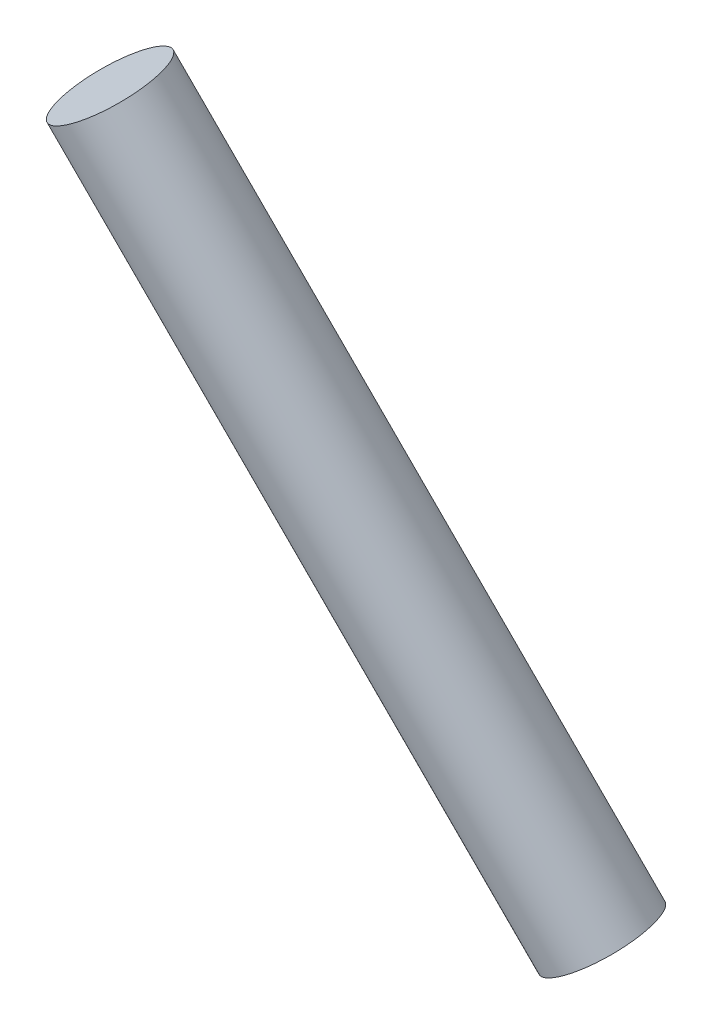
ISO-10303-21;
HEADER;
FILE_DESCRIPTION(('STEP AP214'),'2;1');
FILE_NAME('part.step','',(''),(''),'','','');
FILE_SCHEMA(('AUTOMOTIVE_DESIGN { 1 0 10303 214 1 1 1 1 }'));
ENDSEC;
DATA;
#1=APPLICATION_CONTEXT('core data for automotive mechanical design processes');
#2=APPLICATION_PROTOCOL_DEFINITION('international standard','automotive_design',2000,#1);
#3=PRODUCT_CONTEXT('',#1,'mechanical');
#4=PRODUCT('Part','Part','',(#3));
#5=PRODUCT_RELATED_PRODUCT_CATEGORY('part','',(#4));
#6=PRODUCT_DEFINITION_FORMATION('','',#4);
#7=PRODUCT_DEFINITION_CONTEXT('part definition',#1,'design');
#8=PRODUCT_DEFINITION('design','',#6,#7);
#9=PRODUCT_DEFINITION_SHAPE('','',#8);
#10=(LENGTH_UNIT() NAMED_UNIT(*) SI_UNIT(.MILLI.,.METRE.));
#11=(NAMED_UNIT(*) PLANE_ANGLE_UNIT() SI_UNIT($,.RADIAN.));
#12=(NAMED_UNIT(*) SI_UNIT($,.STERADIAN.) SOLID_ANGLE_UNIT());
#13=UNCERTAINTY_MEASURE_WITH_UNIT(LENGTH_MEASURE(1.E-05),#10,'distance_accuracy_value','');
#14=(GEOMETRIC_REPRESENTATION_CONTEXT(3) GLOBAL_UNCERTAINTY_ASSIGNED_CONTEXT((#13)) GLOBAL_UNIT_ASSIGNED_CONTEXT((#10,
#11,#12)) REPRESENTATION_CONTEXT('',''));
#15=CARTESIAN_POINT('',(0.,0.,0.));
#16=DIRECTION('',(0.,0.,1.));
#17=DIRECTION('',(1.,0.,0.));
#18=AXIS2_PLACEMENT_3D('',#15,#16,#17);
#19=CARTESIAN_POINT('',(-35.967019833505,56.5738701055898,10.3068355582731));
#20=DIRECTION('',(0.530278254025546,-0.834094489950315,-0.151958399380037));
#21=DIRECTION('',(0.843894732074354,0.536508789468686,0.));
#22=AXIS2_PLACEMENT_3D('',#19,#20,#21);
#23=CYLINDRICAL_SURFACE('',#22,2.5);
#24=CARTESIAN_POINT('',(-35.967019833505,56.5738701055898,10.3068355582731));
#25=DIRECTION('',(0.530278254025546,-0.834094489950315,-0.151958399380037));
#26=DIRECTION('',(0.843894732074354,0.536508789468686,0.));
#27=AXIS2_PLACEMENT_3D('',#24,#25,#26);
#28=CIRCLE('',#27,2.5);
#29=CARTESIAN_POINT('',(-33.8572830033191,57.9151420792615,10.3068355582731));
#30=VERTEX_POINT('',#29);
#31=EDGE_CURVE('E10',#30,#30,#28,.T.);
#32=ORIENTED_EDGE('',*,*,#31,.T.);
#33=EDGE_LOOP('',(#32));
#34=FACE_BOUND('',#33,.T.);
#35=CARTESIAN_POINT('',(-17.4072809426109,27.3805629573288,4.98829157997179));
#36=DIRECTION('',(0.530278254025546,-0.834094489950315,-0.151958399380037));
#37=DIRECTION('',(0.843894732074354,0.536508789468686,0.));
#38=AXIS2_PLACEMENT_3D('',#35,#36,#37);
#39=CIRCLE('',#38,2.5);
#40=CARTESIAN_POINT('',(-15.297544112425,28.7218349310005,4.98829157997179));
#41=VERTEX_POINT('',#40);
#42=EDGE_CURVE('E36',#41,#41,#39,.T.);
#43=ORIENTED_EDGE('',*,*,#42,.F.);
#44=EDGE_LOOP('',(#43));
#45=FACE_BOUND('',#44,.T.);
#46=ADVANCED_FACE('F33',(#34,#45),#23,.T.);
#47=CARTESIAN_POINT('',(-35.967019833505,56.5738701055898,10.3068355582731));
#48=DIRECTION('',(0.530278254025546,-0.834094489950315,-0.151958399380037));
#49=DIRECTION('',(0.843894732074354,0.536508789468686,0.));
#50=AXIS2_PLACEMENT_3D('',#47,#48,#49);
#51=PLANE('',#50);
#52=ORIENTED_EDGE('',*,*,#31,.F.);
#53=EDGE_LOOP('',(#52));
#54=FACE_BOUND('',#53,.T.);
#55=ADVANCED_FACE('F48',(#54),#51,.F.);
#56=CARTESIAN_POINT('',(-17.4072809426109,27.3805629573288,4.98829157997179));
#57=DIRECTION('',(0.530278254025546,-0.834094489950315,-0.151958399380037));
#58=DIRECTION('',(0.843894732074354,0.536508789468686,0.));
#59=AXIS2_PLACEMENT_3D('',#56,#57,#58);
#60=PLANE('',#59);
#61=ORIENTED_EDGE('',*,*,#42,.T.);
#62=EDGE_LOOP('',(#61));
#63=FACE_BOUND('',#62,.T.);
#64=ADVANCED_FACE('F45',(#63),#60,.T.);
#65=CLOSED_SHELL('',(#46,#55,#64));
#66=MANIFOLD_SOLID_BREP('B2',#65);
#67=ADVANCED_BREP_SHAPE_REPRESENTATION('',(#18,#66),#14);
#68=SHAPE_DEFINITION_REPRESENTATION(#9,#67);
ENDSEC;
END-ISO-10303-21;
